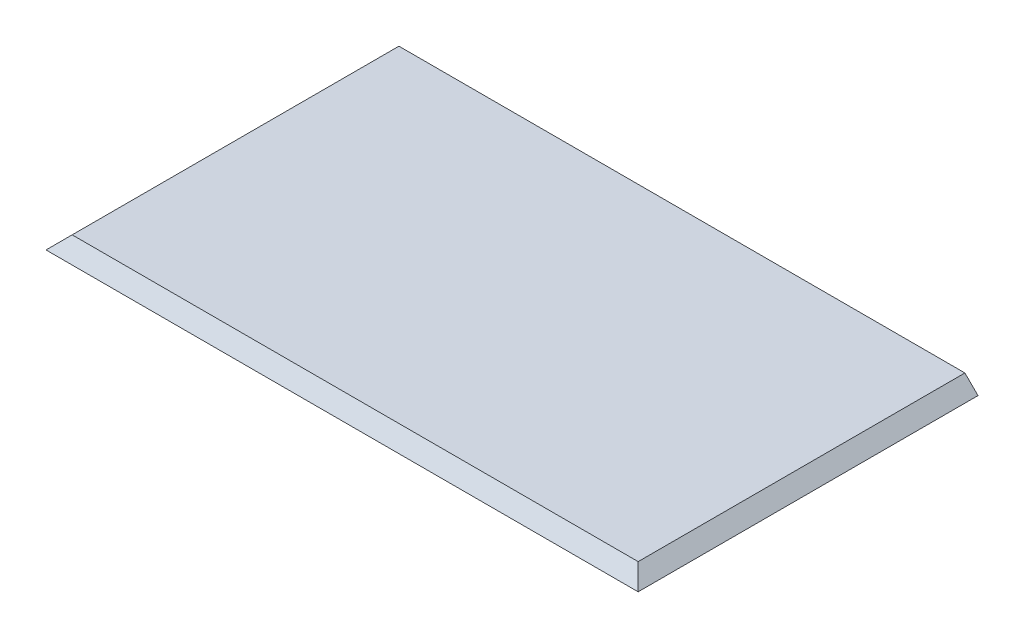
ISO-10303-21;
HEADER;
FILE_DESCRIPTION(('STEP AP214'),'2;1');
FILE_NAME('part.step','',(''),(''),'','','');
FILE_SCHEMA(('AUTOMOTIVE_DESIGN { 1 0 10303 214 1 1 1 1 }'));
ENDSEC;
DATA;
#1=APPLICATION_CONTEXT('core data for automotive mechanical design processes');
#2=APPLICATION_PROTOCOL_DEFINITION('international standard','automotive_design',2000,#1);
#3=PRODUCT_CONTEXT('',#1,'mechanical');
#4=PRODUCT('Part','Part','',(#3));
#5=PRODUCT_RELATED_PRODUCT_CATEGORY('part','',(#4));
#6=PRODUCT_DEFINITION_FORMATION('','',#4);
#7=PRODUCT_DEFINITION_CONTEXT('part definition',#1,'design');
#8=PRODUCT_DEFINITION('design','',#6,#7);
#9=PRODUCT_DEFINITION_SHAPE('','',#8);
#10=(LENGTH_UNIT() NAMED_UNIT(*) SI_UNIT(.MILLI.,.METRE.));
#11=(NAMED_UNIT(*) PLANE_ANGLE_UNIT() SI_UNIT($,.RADIAN.));
#12=(NAMED_UNIT(*) SI_UNIT($,.STERADIAN.) SOLID_ANGLE_UNIT());
#13=UNCERTAINTY_MEASURE_WITH_UNIT(LENGTH_MEASURE(1.E-05),#10,'distance_accuracy_value','');
#14=(GEOMETRIC_REPRESENTATION_CONTEXT(3) GLOBAL_UNCERTAINTY_ASSIGNED_CONTEXT((#13)) GLOBAL_UNIT_ASSIGNED_CONTEXT((#10,
#11,#12)) REPRESENTATION_CONTEXT('',''));
#15=CARTESIAN_POINT('',(0.,0.,0.));
#16=DIRECTION('',(0.,0.,1.));
#17=DIRECTION('',(1.,0.,0.));
#18=AXIS2_PLACEMENT_3D('',#15,#16,#17);
#19=CARTESIAN_POINT('',(287.5,12.7,-165.));
#20=DIRECTION('',(0.,0.,1.));
#21=DIRECTION('',(1.,0.,0.));
#22=AXIS2_PLACEMENT_3D('',#19,#20,#21);
#23=PLANE('',#22);
#24=DIRECTION('',(-1.,0.,0.));
#25=VECTOR('',#24,1.);
#26=CARTESIAN_POINT('',(287.5,12.7,-165.));
#27=LINE('',#26,#25);
#28=CARTESIAN_POINT('',(274.8,12.7,-165.));
#29=VERTEX_POINT('',#28);
#30=CARTESIAN_POINT('',(-274.8,12.7,-165.));
#31=VERTEX_POINT('',#30);
#32=EDGE_CURVE('E104',#29,#31,#27,.T.);
#33=ORIENTED_EDGE('',*,*,#32,.F.);
#34=DIRECTION('',(0.707106781186546,-0.707106781186549,0.));
#35=VECTOR('',#34,1.);
#36=CARTESIAN_POINT('',(274.8,12.7,-165.));
#37=LINE('',#36,#35);
#38=CARTESIAN_POINT('',(287.5,0.,-165.));
#39=VERTEX_POINT('',#38);
#40=EDGE_CURVE('E11',#29,#39,#37,.T.);
#41=ORIENTED_EDGE('',*,*,#40,.T.);
#42=DIRECTION('',(-1.,0.,0.));
#43=VECTOR('',#42,1.);
#44=CARTESIAN_POINT('',(287.5,0.,-165.));
#45=LINE('',#44,#43);
#46=CARTESIAN_POINT('',(-287.5,0.,-165.));
#47=VERTEX_POINT('',#46);
#48=EDGE_CURVE('E105',#39,#47,#45,.T.);
#49=ORIENTED_EDGE('',*,*,#48,.T.);
#50=DIRECTION('',(0.707106781186546,0.707106781186549,0.));
#51=VECTOR('',#50,1.);
#52=CARTESIAN_POINT('',(-274.8,12.7,-165.));
#53=LINE('',#52,#51);
#54=EDGE_CURVE('E46',#47,#31,#53,.T.);
#55=ORIENTED_EDGE('',*,*,#54,.T.);
#56=EDGE_LOOP('',(#33,#41,#49,#55));
#57=FACE_BOUND('',#56,.T.);
#58=ADVANCED_FACE('F37',(#57),#23,.F.);
#59=CARTESIAN_POINT('',(0.,12.7,0.));
#60=DIRECTION('',(0.,1.,0.));
#61=DIRECTION('',(0.,0.,1.));
#62=AXIS2_PLACEMENT_3D('',#59,#60,#61);
#63=PLANE('',#62);
#64=DIRECTION('',(1.,0.,0.));
#65=VECTOR('',#64,1.);
#66=CARTESIAN_POINT('',(287.5,12.7,152.3));
#67=LINE('',#66,#65);
#68=CARTESIAN_POINT('',(-274.8,12.7,152.3));
#69=VERTEX_POINT('',#68);
#70=CARTESIAN_POINT('',(274.8,12.7,152.3));
#71=VERTEX_POINT('',#70);
#72=EDGE_CURVE('E54',#69,#71,#67,.T.);
#73=ORIENTED_EDGE('',*,*,#72,.T.);
#74=DIRECTION('',(0.,0.,-1.));
#75=VECTOR('',#74,1.);
#76=CARTESIAN_POINT('',(274.8,12.7,-165.));
#77=LINE('',#76,#75);
#78=EDGE_CURVE('E100',#71,#29,#77,.T.);
#79=ORIENTED_EDGE('',*,*,#78,.T.);
#80=ORIENTED_EDGE('',*,*,#32,.T.);
#81=DIRECTION('',(0.,0.,1.));
#82=VECTOR('',#81,1.);
#83=CARTESIAN_POINT('',(-274.8,12.7,165.));
#84=LINE('',#83,#82);
#85=EDGE_CURVE('E59',#31,#69,#84,.T.);
#86=ORIENTED_EDGE('',*,*,#85,.T.);
#87=EDGE_LOOP('',(#73,#79,#80,#86));
#88=FACE_BOUND('',#87,.T.);
#89=ADVANCED_FACE('F109',(#88),#63,.T.);
#90=CARTESIAN_POINT('',(0.,0.,0.));
#91=DIRECTION('',(0.,1.,0.));
#92=DIRECTION('',(0.,0.,1.));
#93=AXIS2_PLACEMENT_3D('',#90,#91,#92);
#94=PLANE('',#93);
#95=DIRECTION('',(0.,0.,1.));
#96=VECTOR('',#95,1.);
#97=CARTESIAN_POINT('',(-287.5,0.,165.));
#98=LINE('',#97,#96);
#99=CARTESIAN_POINT('',(-287.5,0.,165.));
#100=VERTEX_POINT('',#99);
#101=EDGE_CURVE('E84',#47,#100,#98,.T.);
#102=ORIENTED_EDGE('',*,*,#101,.F.);
#103=ORIENTED_EDGE('',*,*,#48,.F.);
#104=DIRECTION('',(0.,0.,-1.));
#105=VECTOR('',#104,1.);
#106=CARTESIAN_POINT('',(287.5,0.,165.));
#107=LINE('',#106,#105);
#108=CARTESIAN_POINT('',(287.5,0.,165.));
#109=VERTEX_POINT('',#108);
#110=EDGE_CURVE('E87',#109,#39,#107,.T.);
#111=ORIENTED_EDGE('',*,*,#110,.F.);
#112=DIRECTION('',(1.,0.,0.));
#113=VECTOR('',#112,1.);
#114=CARTESIAN_POINT('',(287.5,0.,165.));
#115=LINE('',#114,#113);
#116=EDGE_CURVE('E80',#100,#109,#115,.T.);
#117=ORIENTED_EDGE('',*,*,#116,.F.);
#118=EDGE_LOOP('',(#102,#103,#111,#117));
#119=FACE_BOUND('',#118,.T.);
#120=ADVANCED_FACE('F82',(#119),#94,.F.);
#121=CARTESIAN_POINT('',(-274.8,12.7,0.));
#122=DIRECTION('',(-0.707106781186549,0.707106781186546,0.));
#123=DIRECTION('',(0.,0.,-1.));
#124=AXIS2_PLACEMENT_3D('',#121,#122,#123);
#125=PLANE('',#124);
#126=ORIENTED_EDGE('',*,*,#54,.F.);
#127=ORIENTED_EDGE('',*,*,#101,.T.);
#128=DIRECTION('',(0.577350269189625,0.577350269189627,-0.577350269189625));
#129=VECTOR('',#128,1.);
#130=CARTESIAN_POINT('',(-224.033333333333,63.4666666666668,101.533333333334));
#131=LINE('',#130,#129);
#132=EDGE_CURVE('E41',#69,#100,#131,.F.);
#133=ORIENTED_EDGE('',*,*,#132,.F.);
#134=ORIENTED_EDGE('',*,*,#85,.F.);
#135=EDGE_LOOP('',(#126,#127,#133,#134));
#136=FACE_BOUND('',#135,.T.);
#137=ADVANCED_FACE('F39',(#136),#125,.T.);
#138=CARTESIAN_POINT('',(0.,12.7,152.3));
#139=DIRECTION('',(0.,0.707106781186546,0.707106781186549));
#140=DIRECTION('',(-1.,0.,0.));
#141=AXIS2_PLACEMENT_3D('',#138,#139,#140);
#142=PLANE('',#141);
#143=ORIENTED_EDGE('',*,*,#132,.T.);
#144=ORIENTED_EDGE('',*,*,#116,.T.);
#145=DIRECTION('',(-0.577350269189625,0.577350269189628,-0.577350269189625));
#146=VECTOR('',#145,1.);
#147=CARTESIAN_POINT('',(183.2,104.3,60.7000000000003));
#148=LINE('',#147,#146);
#149=EDGE_CURVE('E95',#71,#109,#148,.F.);
#150=ORIENTED_EDGE('',*,*,#149,.F.);
#151=ORIENTED_EDGE('',*,*,#72,.F.);
#152=EDGE_LOOP('',(#143,#144,#150,#151));
#153=FACE_BOUND('',#152,.T.);
#154=ADVANCED_FACE('F94',(#153),#142,.T.);
#155=CARTESIAN_POINT('',(274.8,12.7,0.));
#156=DIRECTION('',(0.707106781186549,0.707106781186546,0.));
#157=DIRECTION('',(0.,0.,1.));
#158=AXIS2_PLACEMENT_3D('',#155,#156,#157);
#159=PLANE('',#158);
#160=ORIENTED_EDGE('',*,*,#149,.T.);
#161=ORIENTED_EDGE('',*,*,#110,.T.);
#162=ORIENTED_EDGE('',*,*,#40,.F.);
#163=ORIENTED_EDGE('',*,*,#78,.F.);
#164=EDGE_LOOP('',(#160,#161,#162,#163));
#165=FACE_BOUND('',#164,.T.);
#166=ADVANCED_FACE('F111',(#165),#159,.T.);
#167=CLOSED_SHELL('',(#58,#89,#120,#137,#154,#166));
#168=MANIFOLD_SOLID_BREP('B2',#167);
#169=ADVANCED_BREP_SHAPE_REPRESENTATION('',(#18,#168),#14);
#170=SHAPE_DEFINITION_REPRESENTATION(#9,#169);
ENDSEC;
END-ISO-10303-21;
